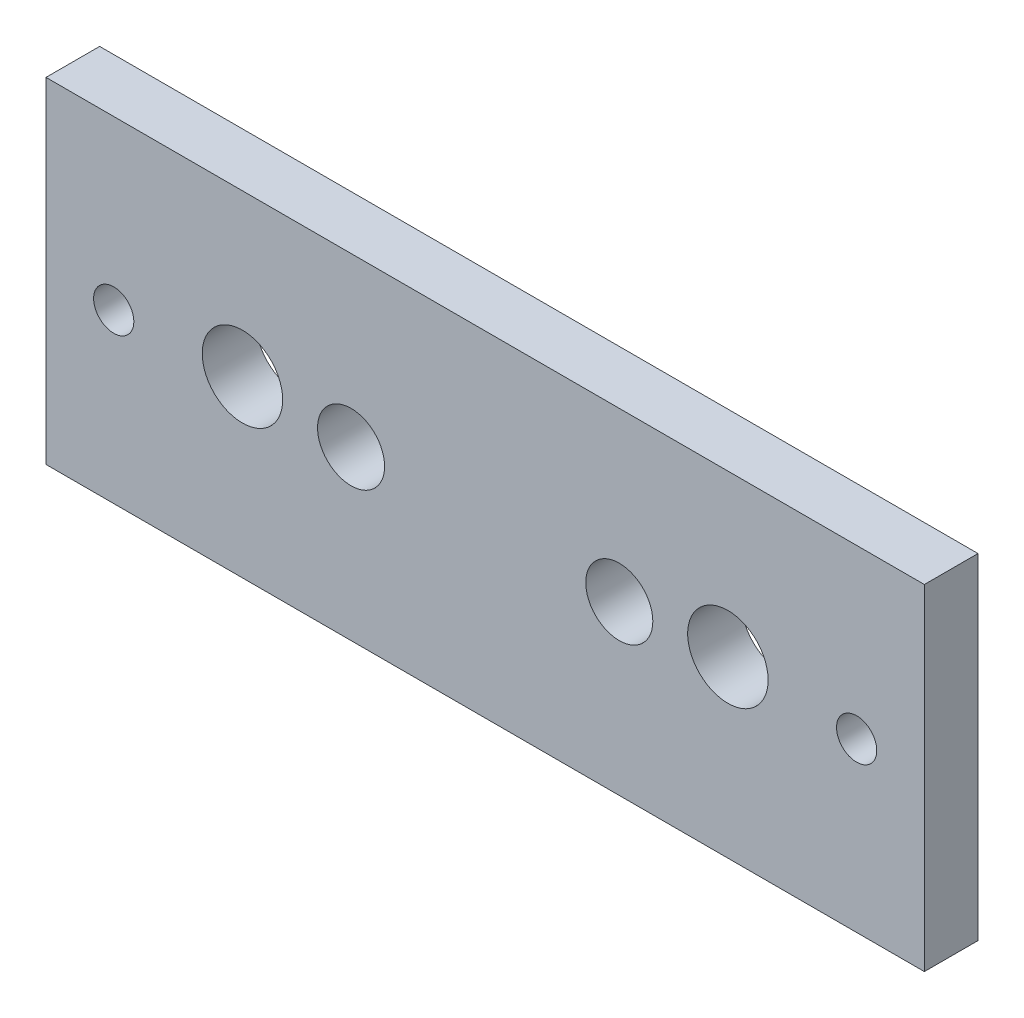
ISO-10303-21;
HEADER;
FILE_DESCRIPTION(('STEP AP214'),'2;1');
FILE_NAME('part.step','',(''),(''),'','','');
FILE_SCHEMA(('AUTOMOTIVE_DESIGN { 1 0 10303 214 1 1 1 1 }'));
ENDSEC;
DATA;
#1=APPLICATION_CONTEXT('core data for automotive mechanical design processes');
#2=APPLICATION_PROTOCOL_DEFINITION('international standard','automotive_design',2000,#1);
#3=PRODUCT_CONTEXT('',#1,'mechanical');
#4=PRODUCT('Part','Part','',(#3));
#5=PRODUCT_RELATED_PRODUCT_CATEGORY('part','',(#4));
#6=PRODUCT_DEFINITION_FORMATION('','',#4);
#7=PRODUCT_DEFINITION_CONTEXT('part definition',#1,'design');
#8=PRODUCT_DEFINITION('design','',#6,#7);
#9=PRODUCT_DEFINITION_SHAPE('','',#8);
#10=(LENGTH_UNIT() NAMED_UNIT(*) SI_UNIT(.MILLI.,.METRE.));
#11=(NAMED_UNIT(*) PLANE_ANGLE_UNIT() SI_UNIT($,.RADIAN.));
#12=(NAMED_UNIT(*) SI_UNIT($,.STERADIAN.) SOLID_ANGLE_UNIT());
#13=UNCERTAINTY_MEASURE_WITH_UNIT(LENGTH_MEASURE(1.E-05),#10,'distance_accuracy_value','');
#14=(GEOMETRIC_REPRESENTATION_CONTEXT(3) GLOBAL_UNCERTAINTY_ASSIGNED_CONTEXT((#13)) GLOBAL_UNIT_ASSIGNED_CONTEXT((#10,
#11,#12)) REPRESENTATION_CONTEXT('',''));
#15=CARTESIAN_POINT('',(0.,0.,0.));
#16=DIRECTION('',(0.,0.,1.));
#17=DIRECTION('',(1.,0.,0.));
#18=AXIS2_PLACEMENT_3D('',#15,#16,#17);
#19=CARTESIAN_POINT('',(0.,0.,4.));
#20=DIRECTION('',(1.,0.,0.));
#21=DIRECTION('',(0.,0.,-1.));
#22=AXIS2_PLACEMENT_3D('',#19,#20,#21);
#23=PLANE('',#22);
#24=DIRECTION('',(0.,-1.,0.));
#25=VECTOR('',#24,1.);
#26=CARTESIAN_POINT('',(0.,0.,0.));
#27=LINE('',#26,#25);
#28=CARTESIAN_POINT('',(0.,25.,0.));
#29=VERTEX_POINT('',#28);
#30=CARTESIAN_POINT('',(0.,0.,0.));
#31=VERTEX_POINT('',#30);
#32=EDGE_CURVE('E96',#29,#31,#27,.T.);
#33=ORIENTED_EDGE('',*,*,#32,.T.);
#34=DIRECTION('',(0.,0.,-1.));
#35=VECTOR('',#34,1.);
#36=CARTESIAN_POINT('',(0.,0.,4.));
#37=LINE('',#36,#35);
#38=CARTESIAN_POINT('',(0.,0.,4.));
#39=VERTEX_POINT('',#38);
#40=EDGE_CURVE('E11',#39,#31,#37,.T.);
#41=ORIENTED_EDGE('',*,*,#40,.F.);
#42=DIRECTION('',(0.,-1.,0.));
#43=VECTOR('',#42,1.);
#44=CARTESIAN_POINT('',(0.,0.,4.));
#45=LINE('',#44,#43);
#46=CARTESIAN_POINT('',(0.,25.,4.));
#47=VERTEX_POINT('',#46);
#48=EDGE_CURVE('E84',#47,#39,#45,.T.);
#49=ORIENTED_EDGE('',*,*,#48,.F.);
#50=DIRECTION('',(0.,0.,-1.));
#51=VECTOR('',#50,1.);
#52=CARTESIAN_POINT('',(0.,25.,4.));
#53=LINE('',#52,#51);
#54=EDGE_CURVE('E92',#47,#29,#53,.T.);
#55=ORIENTED_EDGE('',*,*,#54,.T.);
#56=EDGE_LOOP('',(#33,#41,#49,#55));
#57=FACE_BOUND('',#56,.T.);
#58=ADVANCED_FACE('F33',(#57),#23,.F.);
#59=CARTESIAN_POINT('',(0.,0.,4.));
#60=DIRECTION('',(0.,1.,0.));
#61=DIRECTION('',(0.,0.,1.));
#62=AXIS2_PLACEMENT_3D('',#59,#60,#61);
#63=PLANE('',#62);
#64=DIRECTION('',(1.,0.,0.));
#65=VECTOR('',#64,1.);
#66=CARTESIAN_POINT('',(0.,0.,0.));
#67=LINE('',#66,#65);
#68=CARTESIAN_POINT('',(65.5,0.,0.));
#69=VERTEX_POINT('',#68);
#70=EDGE_CURVE('E88',#31,#69,#67,.T.);
#71=ORIENTED_EDGE('',*,*,#70,.T.);
#72=DIRECTION('',(0.,0.,-1.));
#73=VECTOR('',#72,1.);
#74=CARTESIAN_POINT('',(65.5,0.,4.));
#75=LINE('',#74,#73);
#76=CARTESIAN_POINT('',(65.5,0.,4.));
#77=VERTEX_POINT('',#76);
#78=EDGE_CURVE('E41',#77,#69,#75,.T.);
#79=ORIENTED_EDGE('',*,*,#78,.F.);
#80=DIRECTION('',(1.,0.,0.));
#81=VECTOR('',#80,1.);
#82=CARTESIAN_POINT('',(0.,0.,4.));
#83=LINE('',#82,#81);
#84=EDGE_CURVE('E79',#39,#77,#83,.T.);
#85=ORIENTED_EDGE('',*,*,#84,.F.);
#86=ORIENTED_EDGE('',*,*,#40,.T.);
#87=EDGE_LOOP('',(#71,#79,#85,#86));
#88=FACE_BOUND('',#87,.T.);
#89=ADVANCED_FACE('F87',(#88),#63,.F.);
#90=CARTESIAN_POINT('',(65.5,0.,4.));
#91=DIRECTION('',(-1.,0.,0.));
#92=DIRECTION('',(0.,0.,1.));
#93=AXIS2_PLACEMENT_3D('',#90,#91,#92);
#94=PLANE('',#93);
#95=DIRECTION('',(0.,1.,0.));
#96=VECTOR('',#95,1.);
#97=CARTESIAN_POINT('',(65.5,0.,0.));
#98=LINE('',#97,#96);
#99=CARTESIAN_POINT('',(65.5,25.,0.));
#100=VERTEX_POINT('',#99);
#101=EDGE_CURVE('E66',#69,#100,#98,.T.);
#102=ORIENTED_EDGE('',*,*,#101,.T.);
#103=DIRECTION('',(0.,0.,-1.));
#104=VECTOR('',#103,1.);
#105=CARTESIAN_POINT('',(65.5,25.,4.));
#106=LINE('',#105,#104);
#107=CARTESIAN_POINT('',(65.5,25.,4.));
#108=VERTEX_POINT('',#107);
#109=EDGE_CURVE('E89',#108,#100,#106,.T.);
#110=ORIENTED_EDGE('',*,*,#109,.F.);
#111=DIRECTION('',(0.,1.,0.));
#112=VECTOR('',#111,1.);
#113=CARTESIAN_POINT('',(65.5,0.,4.));
#114=LINE('',#113,#112);
#115=EDGE_CURVE('E82',#77,#108,#114,.T.);
#116=ORIENTED_EDGE('',*,*,#115,.F.);
#117=ORIENTED_EDGE('',*,*,#78,.T.);
#118=EDGE_LOOP('',(#102,#110,#116,#117));
#119=FACE_BOUND('',#118,.T.);
#120=ADVANCED_FACE('F90',(#119),#94,.F.);
#121=CARTESIAN_POINT('',(0.,25.,4.));
#122=DIRECTION('',(0.,-1.,0.));
#123=DIRECTION('',(0.,0.,-1.));
#124=AXIS2_PLACEMENT_3D('',#121,#122,#123);
#125=PLANE('',#124);
#126=DIRECTION('',(-1.,0.,0.));
#127=VECTOR('',#126,1.);
#128=CARTESIAN_POINT('',(0.,25.,0.));
#129=LINE('',#128,#127);
#130=EDGE_CURVE('E72',#100,#29,#129,.T.);
#131=ORIENTED_EDGE('',*,*,#130,.T.);
#132=ORIENTED_EDGE('',*,*,#54,.F.);
#133=DIRECTION('',(-1.,0.,0.));
#134=VECTOR('',#133,1.);
#135=CARTESIAN_POINT('',(0.,25.,4.));
#136=LINE('',#135,#134);
#137=EDGE_CURVE('E49',#108,#47,#136,.T.);
#138=ORIENTED_EDGE('',*,*,#137,.F.);
#139=ORIENTED_EDGE('',*,*,#109,.T.);
#140=EDGE_LOOP('',(#131,#132,#138,#139));
#141=FACE_BOUND('',#140,.T.);
#142=ADVANCED_FACE('F104',(#141),#125,.F.);
#143=CARTESIAN_POINT('',(0.,0.,4.));
#144=DIRECTION('',(0.,0.,-1.));
#145=DIRECTION('',(-1.,0.,0.));
#146=AXIS2_PLACEMENT_3D('',#143,#144,#145);
#147=PLANE('',#146);
#148=CARTESIAN_POINT('',(5.05,12.5,4.));
#149=DIRECTION('',(0.,0.,1.));
#150=DIRECTION('',(1.,0.,0.));
#151=AXIS2_PLACEMENT_3D('',#148,#149,#150);
#152=CIRCLE('',#151,1.5);
#153=CARTESIAN_POINT('',(6.55,12.5,4.));
#154=VERTEX_POINT('',#153);
#155=EDGE_CURVE('E142',#154,#154,#152,.T.);
#156=ORIENTED_EDGE('',*,*,#155,.F.);
#157=EDGE_LOOP('',(#156));
#158=FACE_BOUND('',#157,.T.);
#159=CARTESIAN_POINT('',(60.45,12.5,4.));
#160=DIRECTION('',(0.,0.,1.));
#161=DIRECTION('',(1.,0.,0.));
#162=AXIS2_PLACEMENT_3D('',#159,#160,#161);
#163=CIRCLE('',#162,1.5);
#164=CARTESIAN_POINT('',(61.95,12.5,4.));
#165=VERTEX_POINT('',#164);
#166=EDGE_CURVE('E136',#165,#165,#163,.T.);
#167=ORIENTED_EDGE('',*,*,#166,.F.);
#168=EDGE_LOOP('',(#167));
#169=FACE_BOUND('',#168,.T.);
#170=CARTESIAN_POINT('',(14.65,13.,4.));
#171=DIRECTION('',(0.,0.,1.));
#172=DIRECTION('',(1.,0.,0.));
#173=AXIS2_PLACEMENT_3D('',#170,#171,#172);
#174=CIRCLE('',#173,3.);
#175=CARTESIAN_POINT('',(17.65,13.,4.));
#176=VERTEX_POINT('',#175);
#177=EDGE_CURVE('E129',#176,#176,#174,.T.);
#178=ORIENTED_EDGE('',*,*,#177,.F.);
#179=EDGE_LOOP('',(#178));
#180=FACE_BOUND('',#179,.T.);
#181=CARTESIAN_POINT('',(50.85,13.,4.));
#182=DIRECTION('',(0.,0.,1.));
#183=DIRECTION('',(1.,0.,0.));
#184=AXIS2_PLACEMENT_3D('',#181,#182,#183);
#185=CIRCLE('',#184,3.);
#186=CARTESIAN_POINT('',(53.85,13.,4.));
#187=VERTEX_POINT('',#186);
#188=EDGE_CURVE('E122',#187,#187,#185,.T.);
#189=ORIENTED_EDGE('',*,*,#188,.F.);
#190=EDGE_LOOP('',(#189));
#191=FACE_BOUND('',#190,.T.);
#192=CARTESIAN_POINT('',(22.75,12.5,4.));
#193=DIRECTION('',(0.,0.,1.));
#194=DIRECTION('',(1.,0.,0.));
#195=AXIS2_PLACEMENT_3D('',#192,#193,#194);
#196=CIRCLE('',#195,2.49999999999999);
#197=CARTESIAN_POINT('',(25.25,12.5,4.));
#198=VERTEX_POINT('',#197);
#199=EDGE_CURVE('E118',#198,#198,#196,.T.);
#200=ORIENTED_EDGE('',*,*,#199,.F.);
#201=EDGE_LOOP('',(#200));
#202=FACE_BOUND('',#201,.T.);
#203=CARTESIAN_POINT('',(42.75,12.5,4.));
#204=DIRECTION('',(0.,0.,1.));
#205=DIRECTION('',(1.,0.,0.));
#206=AXIS2_PLACEMENT_3D('',#203,#204,#205);
#207=CIRCLE('',#206,2.49999999999999);
#208=CARTESIAN_POINT('',(45.25,12.5,4.));
#209=VERTEX_POINT('',#208);
#210=EDGE_CURVE('E112',#209,#209,#207,.T.);
#211=ORIENTED_EDGE('',*,*,#210,.F.);
#212=EDGE_LOOP('',(#211));
#213=FACE_BOUND('',#212,.T.);
#214=ORIENTED_EDGE('',*,*,#48,.T.);
#215=ORIENTED_EDGE('',*,*,#84,.T.);
#216=ORIENTED_EDGE('',*,*,#115,.T.);
#217=ORIENTED_EDGE('',*,*,#137,.T.);
#218=EDGE_LOOP('',(#214,#215,#216,#217));
#219=FACE_BOUND('',#218,.T.);
#220=ADVANCED_FACE('F80',(#158,#169,#180,#191,#202,#213,#219),#147,.F.);
#221=CARTESIAN_POINT('',(0.,0.,0.));
#222=DIRECTION('',(0.,0.,-1.));
#223=DIRECTION('',(-1.,0.,0.));
#224=AXIS2_PLACEMENT_3D('',#221,#222,#223);
#225=PLANE('',#224);
#226=CARTESIAN_POINT('',(5.05,12.5,0.));
#227=DIRECTION('',(0.,0.,1.));
#228=DIRECTION('',(1.,0.,0.));
#229=AXIS2_PLACEMENT_3D('',#226,#227,#228);
#230=CIRCLE('',#229,1.5);
#231=CARTESIAN_POINT('',(6.55,12.5,0.));
#232=VERTEX_POINT('',#231);
#233=EDGE_CURVE('E139',#232,#232,#230,.T.);
#234=ORIENTED_EDGE('',*,*,#233,.T.);
#235=EDGE_LOOP('',(#234));
#236=FACE_BOUND('',#235,.T.);
#237=CARTESIAN_POINT('',(60.45,12.5,0.));
#238=DIRECTION('',(0.,0.,1.));
#239=DIRECTION('',(1.,0.,0.));
#240=AXIS2_PLACEMENT_3D('',#237,#238,#239);
#241=CIRCLE('',#240,1.5);
#242=CARTESIAN_POINT('',(61.95,12.5,0.));
#243=VERTEX_POINT('',#242);
#244=EDGE_CURVE('E126',#243,#243,#241,.T.);
#245=ORIENTED_EDGE('',*,*,#244,.T.);
#246=EDGE_LOOP('',(#245));
#247=FACE_BOUND('',#246,.T.);
#248=CARTESIAN_POINT('',(14.65,13.,0.));
#249=DIRECTION('',(0.,0.,1.));
#250=DIRECTION('',(1.,0.,0.));
#251=AXIS2_PLACEMENT_3D('',#248,#249,#250);
#252=CIRCLE('',#251,3.);
#253=CARTESIAN_POINT('',(17.65,13.,0.));
#254=VERTEX_POINT('',#253);
#255=EDGE_CURVE('E121',#254,#254,#252,.T.);
#256=ORIENTED_EDGE('',*,*,#255,.T.);
#257=EDGE_LOOP('',(#256));
#258=FACE_BOUND('',#257,.T.);
#259=CARTESIAN_POINT('',(50.85,13.,0.));
#260=DIRECTION('',(0.,0.,1.));
#261=DIRECTION('',(1.,0.,0.));
#262=AXIS2_PLACEMENT_3D('',#259,#260,#261);
#263=CIRCLE('',#262,3.);
#264=CARTESIAN_POINT('',(53.85,13.,0.));
#265=VERTEX_POINT('',#264);
#266=EDGE_CURVE('E125',#265,#265,#263,.T.);
#267=ORIENTED_EDGE('',*,*,#266,.T.);
#268=EDGE_LOOP('',(#267));
#269=FACE_BOUND('',#268,.T.);
#270=CARTESIAN_POINT('',(22.75,12.5,0.));
#271=DIRECTION('',(0.,0.,1.));
#272=DIRECTION('',(1.,0.,0.));
#273=AXIS2_PLACEMENT_3D('',#270,#271,#272);
#274=CIRCLE('',#273,2.5);
#275=CARTESIAN_POINT('',(25.25,12.5,0.));
#276=VERTEX_POINT('',#275);
#277=EDGE_CURVE('E115',#276,#276,#274,.T.);
#278=ORIENTED_EDGE('',*,*,#277,.T.);
#279=EDGE_LOOP('',(#278));
#280=FACE_BOUND('',#279,.T.);
#281=CARTESIAN_POINT('',(42.75,12.5,0.));
#282=DIRECTION('',(0.,0.,1.));
#283=DIRECTION('',(1.,0.,0.));
#284=AXIS2_PLACEMENT_3D('',#281,#282,#283);
#285=CIRCLE('',#284,2.5);
#286=CARTESIAN_POINT('',(45.25,12.5,0.));
#287=VERTEX_POINT('',#286);
#288=EDGE_CURVE('E99',#287,#287,#285,.T.);
#289=ORIENTED_EDGE('',*,*,#288,.T.);
#290=EDGE_LOOP('',(#289));
#291=FACE_BOUND('',#290,.T.);
#292=ORIENTED_EDGE('',*,*,#32,.F.);
#293=ORIENTED_EDGE('',*,*,#130,.F.);
#294=ORIENTED_EDGE('',*,*,#101,.F.);
#295=ORIENTED_EDGE('',*,*,#70,.F.);
#296=EDGE_LOOP('',(#292,#293,#294,#295));
#297=FACE_BOUND('',#296,.T.);
#298=ADVANCED_FACE('F107',(#236,#247,#258,#269,#280,#291,#297),#225,.T.);
#299=CARTESIAN_POINT('',(42.75,12.5,4.));
#300=DIRECTION('',(0.,0.,1.));
#301=DIRECTION('',(1.,0.,0.));
#302=AXIS2_PLACEMENT_3D('',#299,#300,#301);
#303=CYLINDRICAL_SURFACE('',#302,2.5);
#304=ORIENTED_EDGE('',*,*,#288,.F.);
#305=EDGE_LOOP('',(#304));
#306=FACE_BOUND('',#305,.T.);
#307=ORIENTED_EDGE('',*,*,#210,.T.);
#308=EDGE_LOOP('',(#307));
#309=FACE_BOUND('',#308,.T.);
#310=ADVANCED_FACE('F161',(#306,#309),#303,.F.);
#311=CARTESIAN_POINT('',(22.75,12.5,4.));
#312=DIRECTION('',(0.,0.,1.));
#313=DIRECTION('',(1.,0.,0.));
#314=AXIS2_PLACEMENT_3D('',#311,#312,#313);
#315=CYLINDRICAL_SURFACE('',#314,2.49999999999999);
#316=ORIENTED_EDGE('',*,*,#277,.F.);
#317=EDGE_LOOP('',(#316));
#318=FACE_BOUND('',#317,.T.);
#319=ORIENTED_EDGE('',*,*,#199,.T.);
#320=EDGE_LOOP('',(#319));
#321=FACE_BOUND('',#320,.T.);
#322=ADVANCED_FACE('F163',(#318,#321),#315,.F.);
#323=CARTESIAN_POINT('',(50.85,13.,0.));
#324=DIRECTION('',(0.,0.,1.));
#325=DIRECTION('',(1.,0.,0.));
#326=AXIS2_PLACEMENT_3D('',#323,#324,#325);
#327=CYLINDRICAL_SURFACE('',#326,3.);
#328=ORIENTED_EDGE('',*,*,#266,.F.);
#329=EDGE_LOOP('',(#328));
#330=FACE_BOUND('',#329,.T.);
#331=ORIENTED_EDGE('',*,*,#188,.T.);
#332=EDGE_LOOP('',(#331));
#333=FACE_BOUND('',#332,.T.);
#334=ADVANCED_FACE('F170',(#330,#333),#327,.F.);
#335=CARTESIAN_POINT('',(14.65,13.,0.));
#336=DIRECTION('',(0.,0.,1.));
#337=DIRECTION('',(1.,0.,0.));
#338=AXIS2_PLACEMENT_3D('',#335,#336,#337);
#339=CYLINDRICAL_SURFACE('',#338,3.);
#340=ORIENTED_EDGE('',*,*,#255,.F.);
#341=EDGE_LOOP('',(#340));
#342=FACE_BOUND('',#341,.T.);
#343=ORIENTED_EDGE('',*,*,#177,.T.);
#344=EDGE_LOOP('',(#343));
#345=FACE_BOUND('',#344,.T.);
#346=ADVANCED_FACE('F210',(#342,#345),#339,.F.);
#347=CARTESIAN_POINT('',(60.45,12.5,4.));
#348=DIRECTION('',(0.,0.,1.));
#349=DIRECTION('',(1.,0.,0.));
#350=AXIS2_PLACEMENT_3D('',#347,#348,#349);
#351=CYLINDRICAL_SURFACE('',#350,1.5);
#352=ORIENTED_EDGE('',*,*,#244,.F.);
#353=EDGE_LOOP('',(#352));
#354=FACE_BOUND('',#353,.T.);
#355=ORIENTED_EDGE('',*,*,#166,.T.);
#356=EDGE_LOOP('',(#355));
#357=FACE_BOUND('',#356,.T.);
#358=ADVANCED_FACE('F205',(#354,#357),#351,.F.);
#359=CARTESIAN_POINT('',(5.05,12.5,4.));
#360=DIRECTION('',(0.,0.,1.));
#361=DIRECTION('',(1.,0.,0.));
#362=AXIS2_PLACEMENT_3D('',#359,#360,#361);
#363=CYLINDRICAL_SURFACE('',#362,1.5);
#364=ORIENTED_EDGE('',*,*,#233,.F.);
#365=EDGE_LOOP('',(#364));
#366=FACE_BOUND('',#365,.T.);
#367=ORIENTED_EDGE('',*,*,#155,.T.);
#368=EDGE_LOOP('',(#367));
#369=FACE_BOUND('',#368,.T.);
#370=ADVANCED_FACE('F146',(#366,#369),#363,.F.);
#371=CLOSED_SHELL('',(#58,#89,#120,#142,#220,#298,#310,#322,#334,#346,#358,#370));
#372=MANIFOLD_SOLID_BREP('B2',#371);
#373=ADVANCED_BREP_SHAPE_REPRESENTATION('',(#18,#372),#14);
#374=SHAPE_DEFINITION_REPRESENTATION(#9,#373);
ENDSEC;
END-ISO-10303-21;
